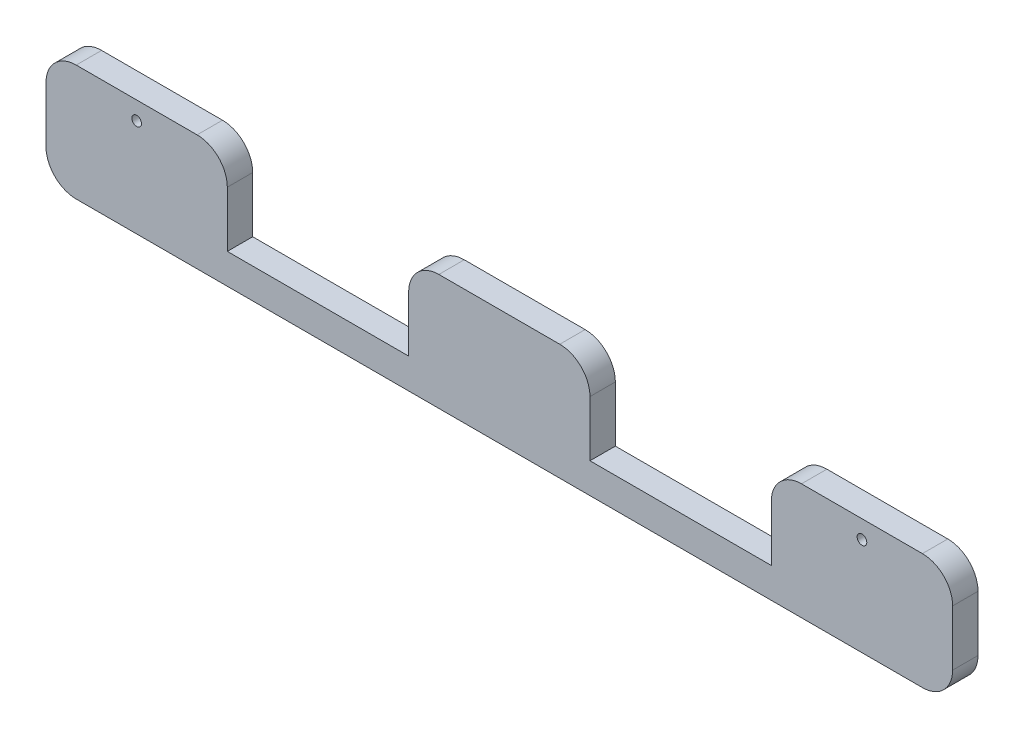
ISO-10303-21;
HEADER;
FILE_DESCRIPTION(('STEP AP214'),'2;1');
FILE_NAME('part.step','',(''),(''),'','','');
FILE_SCHEMA(('AUTOMOTIVE_DESIGN { 1 0 10303 214 1 1 1 1 }'));
ENDSEC;
DATA;
#1=APPLICATION_CONTEXT('core data for automotive mechanical design processes');
#2=APPLICATION_PROTOCOL_DEFINITION('international standard','automotive_design',2000,#1);
#3=PRODUCT_CONTEXT('',#1,'mechanical');
#4=PRODUCT('Part','Part','',(#3));
#5=PRODUCT_RELATED_PRODUCT_CATEGORY('part','',(#4));
#6=PRODUCT_DEFINITION_FORMATION('','',#4);
#7=PRODUCT_DEFINITION_CONTEXT('part definition',#1,'design');
#8=PRODUCT_DEFINITION('design','',#6,#7);
#9=PRODUCT_DEFINITION_SHAPE('','',#8);
#10=(LENGTH_UNIT() NAMED_UNIT(*) SI_UNIT(.MILLI.,.METRE.));
#11=(NAMED_UNIT(*) PLANE_ANGLE_UNIT() SI_UNIT($,.RADIAN.));
#12=(NAMED_UNIT(*) SI_UNIT($,.STERADIAN.) SOLID_ANGLE_UNIT());
#13=UNCERTAINTY_MEASURE_WITH_UNIT(LENGTH_MEASURE(1.E-05),#10,'distance_accuracy_value','');
#14=(GEOMETRIC_REPRESENTATION_CONTEXT(3) GLOBAL_UNCERTAINTY_ASSIGNED_CONTEXT((#13)) GLOBAL_UNIT_ASSIGNED_CONTEXT((#10,
#11,#12)) REPRESENTATION_CONTEXT('',''));
#15=CARTESIAN_POINT('',(0.,0.,0.));
#16=DIRECTION('',(0.,0.,1.));
#17=DIRECTION('',(1.,0.,0.));
#18=AXIS2_PLACEMENT_3D('',#15,#16,#17);
#19=CARTESIAN_POINT('',(-85.0624454176962,-35.0708196621493,5.334));
#20=DIRECTION('',(0.,-1.,0.));
#21=DIRECTION('',(0.,0.,-1.));
#22=AXIS2_PLACEMENT_3D('',#19,#20,#21);
#23=PLANE('',#22);
#24=DIRECTION('',(-1.,0.,0.));
#25=VECTOR('',#24,1.);
#26=CARTESIAN_POINT('',(-85.0624454176962,-35.0708196621493,5.334));
#27=LINE('',#26,#25);
#28=CARTESIAN_POINT('',(22.8875545823038,-35.0708196621493,5.334));
#29=VERTEX_POINT('',#28);
#30=CARTESIAN_POINT('',(-2.5124454176962,-35.0708196621493,5.334));
#31=VERTEX_POINT('',#30);
#32=EDGE_CURVE('E245',#29,#31,#27,.T.);
#33=ORIENTED_EDGE('',*,*,#32,.F.);
#34=DIRECTION('',(0.,0.,1.));
#35=VECTOR('',#34,1.);
#36=CARTESIAN_POINT('',(22.8875545823038,-35.0708196621493,5.334));
#37=LINE('',#36,#35);
#38=CARTESIAN_POINT('',(22.8875545823038,-35.0708196621493,0.));
#39=VERTEX_POINT('',#38);
#40=EDGE_CURVE('E278',#29,#39,#37,.F.);
#41=ORIENTED_EDGE('',*,*,#40,.T.);
#42=DIRECTION('',(-1.,0.,0.));
#43=VECTOR('',#42,1.);
#44=CARTESIAN_POINT('',(-85.0624454176962,-35.0708196621493,0.));
#45=LINE('',#44,#43);
#46=CARTESIAN_POINT('',(-2.5124454176962,-35.0708196621493,0.));
#47=VERTEX_POINT('',#46);
#48=EDGE_CURVE('E257',#39,#47,#45,.T.);
#49=ORIENTED_EDGE('',*,*,#48,.T.);
#50=DIRECTION('',(0.,0.,1.));
#51=VECTOR('',#50,1.);
#52=CARTESIAN_POINT('',(-2.5124454176962,-35.0708196621493,5.334));
#53=LINE('',#52,#51);
#54=EDGE_CURVE('E275',#47,#31,#53,.T.);
#55=ORIENTED_EDGE('',*,*,#54,.T.);
#56=EDGE_LOOP('',(#33,#41,#49,#55));
#57=FACE_BOUND('',#56,.T.);
#58=ADVANCED_FACE('F35',(#57),#23,.F.);
#59=CARTESIAN_POINT('',(-53.3124454176962,-35.0708196621493,5.334));
#60=VERTEX_POINT('',#59);
#61=CARTESIAN_POINT('',(-78.7124454176962,-35.0708196621493,5.334));
#62=VERTEX_POINT('',#61);
#63=EDGE_CURVE('E240',#60,#62,#27,.T.);
#64=ORIENTED_EDGE('',*,*,#63,.F.);
#65=DIRECTION('',(0.,0.,1.));
#66=VECTOR('',#65,1.);
#67=CARTESIAN_POINT('',(-53.3124454176962,-35.0708196621493,5.334));
#68=LINE('',#67,#66);
#69=CARTESIAN_POINT('',(-53.3124454176962,-35.0708196621493,0.));
#70=VERTEX_POINT('',#69);
#71=EDGE_CURVE('E300',#60,#70,#68,.F.);
#72=ORIENTED_EDGE('',*,*,#71,.T.);
#73=CARTESIAN_POINT('',(-78.7124454176962,-35.0708196621493,0.));
#74=VERTEX_POINT('',#73);
#75=EDGE_CURVE('E254',#70,#74,#45,.T.);
#76=ORIENTED_EDGE('',*,*,#75,.T.);
#77=DIRECTION('',(0.,0.,-1.));
#78=VECTOR('',#77,1.);
#79=CARTESIAN_POINT('',(-78.7124454176962,-35.0708196621493,5.334));
#80=LINE('',#79,#78);
#81=EDGE_CURVE('E298',#74,#62,#80,.F.);
#82=ORIENTED_EDGE('',*,*,#81,.T.);
#83=EDGE_LOOP('',(#64,#72,#76,#82));
#84=FACE_BOUND('',#83,.T.);
#85=ADVANCED_FACE('F377',(#84),#23,.F.);
#86=CARTESIAN_POINT('',(-85.0624454176962,-35.0708196621493,5.334));
#87=DIRECTION('',(1.,0.,0.));
#88=DIRECTION('',(0.,1.,0.));
#89=AXIS2_PLACEMENT_3D('',#86,#87,#88);
#90=PLANE('',#89);
#91=DIRECTION('',(0.,-1.,0.));
#92=VECTOR('',#91,1.);
#93=CARTESIAN_POINT('',(-85.0624454176962,-35.0708196621493,0.));
#94=LINE('',#93,#92);
#95=CARTESIAN_POINT('',(-85.0624454176962,-41.4208196621493,0.));
#96=VERTEX_POINT('',#95);
#97=CARTESIAN_POINT('',(-85.0624454176962,-53.1048196621493,0.));
#98=VERTEX_POINT('',#97);
#99=EDGE_CURVE('E227',#96,#98,#94,.T.);
#100=ORIENTED_EDGE('',*,*,#99,.T.);
#101=DIRECTION('',(0.,0.,-1.));
#102=VECTOR('',#101,1.);
#103=CARTESIAN_POINT('',(-85.0624454176962,-53.1048196621493,5.334));
#104=LINE('',#103,#102);
#105=CARTESIAN_POINT('',(-85.0624454176962,-53.1048196621493,5.334));
#106=VERTEX_POINT('',#105);
#107=EDGE_CURVE('E11',#98,#106,#104,.F.);
#108=ORIENTED_EDGE('',*,*,#107,.T.);
#109=DIRECTION('',(0.,-1.,0.));
#110=VECTOR('',#109,1.);
#111=CARTESIAN_POINT('',(-85.0624454176962,-35.0708196621493,5.334));
#112=LINE('',#111,#110);
#113=CARTESIAN_POINT('',(-85.0624454176962,-41.4208196621493,5.334));
#114=VERTEX_POINT('',#113);
#115=EDGE_CURVE('E230',#114,#106,#112,.T.);
#116=ORIENTED_EDGE('',*,*,#115,.F.);
#117=DIRECTION('',(0.,0.,-1.));
#118=VECTOR('',#117,1.);
#119=CARTESIAN_POINT('',(-85.0624454176962,-41.4208196621493,5.334));
#120=LINE('',#119,#118);
#121=EDGE_CURVE('E43',#114,#96,#120,.T.);
#122=ORIENTED_EDGE('',*,*,#121,.T.);
#123=EDGE_LOOP('',(#100,#108,#116,#122));
#124=FACE_BOUND('',#123,.T.);
#125=ADVANCED_FACE('F324',(#124),#90,.F.);
#126=CARTESIAN_POINT('',(-85.0624454176962,-59.4548196621493,5.334));
#127=DIRECTION('',(0.,1.,0.));
#128=DIRECTION('',(0.,0.,1.));
#129=AXIS2_PLACEMENT_3D('',#126,#127,#128);
#130=PLANE('',#129);
#131=DIRECTION('',(1.,0.,0.));
#132=VECTOR('',#131,1.);
#133=CARTESIAN_POINT('',(-85.0624454176962,-59.4548196621493,0.));
#134=LINE('',#133,#132);
#135=CARTESIAN_POINT('',(-78.7124454176962,-59.4548196621493,0.));
#136=VERTEX_POINT('',#135);
#137=CARTESIAN_POINT('',(99.0875545823038,-59.4548196621493,0.));
#138=VERTEX_POINT('',#137);
#139=EDGE_CURVE('E248',#136,#138,#134,.T.);
#140=ORIENTED_EDGE('',*,*,#139,.T.);
#141=DIRECTION('',(0.,0.,-1.));
#142=VECTOR('',#141,1.);
#143=CARTESIAN_POINT('',(99.0875545823038,-59.4548196621493,5.334));
#144=LINE('',#143,#142);
#145=CARTESIAN_POINT('',(99.0875545823038,-59.4548196621493,5.334));
#146=VERTEX_POINT('',#145);
#147=EDGE_CURVE('E318',#138,#146,#144,.F.);
#148=ORIENTED_EDGE('',*,*,#147,.T.);
#149=DIRECTION('',(1.,0.,0.));
#150=VECTOR('',#149,1.);
#151=CARTESIAN_POINT('',(-85.0624454176962,-59.4548196621493,5.334));
#152=LINE('',#151,#150);
#153=CARTESIAN_POINT('',(-78.7124454176962,-59.4548196621493,5.334));
#154=VERTEX_POINT('',#153);
#155=EDGE_CURVE('E233',#154,#146,#152,.T.);
#156=ORIENTED_EDGE('',*,*,#155,.F.);
#157=DIRECTION('',(0.,0.,-1.));
#158=VECTOR('',#157,1.);
#159=CARTESIAN_POINT('',(-78.7124454176962,-59.4548196621493,5.334));
#160=LINE('',#159,#158);
#161=EDGE_CURVE('E315',#154,#136,#160,.T.);
#162=ORIENTED_EDGE('',*,*,#161,.T.);
#163=EDGE_LOOP('',(#140,#148,#156,#162));
#164=FACE_BOUND('',#163,.T.);
#165=ADVANCED_FACE('F335',(#164),#130,.F.);
#166=CARTESIAN_POINT('',(105.437554582304,-35.0708196621493,5.334));
#167=DIRECTION('',(-1.,0.,0.));
#168=DIRECTION('',(0.,-1.,0.));
#169=AXIS2_PLACEMENT_3D('',#166,#167,#168);
#170=PLANE('',#169);
#171=DIRECTION('',(0.,1.,0.));
#172=VECTOR('',#171,1.);
#173=CARTESIAN_POINT('',(105.437554582304,-35.0708196621493,0.));
#174=LINE('',#173,#172);
#175=CARTESIAN_POINT('',(105.437554582304,-53.1048196621493,0.));
#176=VERTEX_POINT('',#175);
#177=CARTESIAN_POINT('',(105.437554582304,-41.4208196621493,0.));
#178=VERTEX_POINT('',#177);
#179=EDGE_CURVE('E251',#176,#178,#174,.T.);
#180=ORIENTED_EDGE('',*,*,#179,.T.);
#181=DIRECTION('',(0.,0.,-1.));
#182=VECTOR('',#181,1.);
#183=CARTESIAN_POINT('',(105.437554582304,-41.4208196621493,5.334));
#184=LINE('',#183,#182);
#185=CARTESIAN_POINT('',(105.437554582304,-41.4208196621493,5.334));
#186=VERTEX_POINT('',#185);
#187=EDGE_CURVE('E313',#178,#186,#184,.F.);
#188=ORIENTED_EDGE('',*,*,#187,.T.);
#189=DIRECTION('',(0.,1.,0.));
#190=VECTOR('',#189,1.);
#191=CARTESIAN_POINT('',(105.437554582304,-35.0708196621493,5.334));
#192=LINE('',#191,#190);
#193=CARTESIAN_POINT('',(105.437554582304,-53.1048196621493,5.334));
#194=VERTEX_POINT('',#193);
#195=EDGE_CURVE('E237',#194,#186,#192,.T.);
#196=ORIENTED_EDGE('',*,*,#195,.F.);
#197=DIRECTION('',(0.,0.,-1.));
#198=VECTOR('',#197,1.);
#199=CARTESIAN_POINT('',(105.437554582304,-53.1048196621493,5.334));
#200=LINE('',#199,#198);
#201=EDGE_CURVE('E310',#194,#176,#200,.T.);
#202=ORIENTED_EDGE('',*,*,#201,.T.);
#203=EDGE_LOOP('',(#180,#188,#196,#202));
#204=FACE_BOUND('',#203,.T.);
#205=ADVANCED_FACE('F346',(#204),#170,.F.);
#206=CARTESIAN_POINT('',(99.0875545823038,-35.0708196621493,0.));
#207=VERTEX_POINT('',#206);
#208=CARTESIAN_POINT('',(73.6875545823038,-35.0708196621493,0.));
#209=VERTEX_POINT('',#208);
#210=EDGE_CURVE('E234',#207,#209,#45,.T.);
#211=ORIENTED_EDGE('',*,*,#210,.T.);
#212=DIRECTION('',(0.,0.,1.));
#213=VECTOR('',#212,1.);
#214=CARTESIAN_POINT('',(73.6875545823038,-35.0708196621493,5.334));
#215=LINE('',#214,#213);
#216=CARTESIAN_POINT('',(73.6875545823038,-35.0708196621493,5.334));
#217=VERTEX_POINT('',#216);
#218=EDGE_CURVE('E305',#209,#217,#215,.T.);
#219=ORIENTED_EDGE('',*,*,#218,.T.);
#220=CARTESIAN_POINT('',(99.0875545823038,-35.0708196621493,5.334));
#221=VERTEX_POINT('',#220);
#222=EDGE_CURVE('E241',#221,#217,#27,.T.);
#223=ORIENTED_EDGE('',*,*,#222,.F.);
#224=DIRECTION('',(0.,0.,-1.));
#225=VECTOR('',#224,1.);
#226=CARTESIAN_POINT('',(99.0875545823038,-35.0708196621493,5.334));
#227=LINE('',#226,#225);
#228=EDGE_CURVE('E302',#221,#207,#227,.T.);
#229=ORIENTED_EDGE('',*,*,#228,.T.);
#230=EDGE_LOOP('',(#211,#219,#223,#229));
#231=FACE_BOUND('',#230,.T.);
#232=ADVANCED_FACE('F356',(#231),#23,.F.);
#233=CARTESIAN_POINT('',(0.,0.,5.334));
#234=DIRECTION('',(0.,0.,1.));
#235=DIRECTION('',(1.,0.,0.));
#236=AXIS2_PLACEMENT_3D('',#233,#234,#235);
#237=PLANE('',#236);
#238=CARTESIAN_POINT('',(86.3875545823038,-38.8808196621493,5.334));
#239=DIRECTION('',(0.,0.,1.));
#240=DIRECTION('',(-1.,0.,0.));
#241=AXIS2_PLACEMENT_3D('',#238,#239,#240);
#242=CIRCLE('',#241,1.016);
#243=CARTESIAN_POINT('',(85.3715545823038,-38.8808196621493,5.334));
#244=VERTEX_POINT('',#243);
#245=EDGE_CURVE('E456',#244,#244,#242,.T.);
#246=ORIENTED_EDGE('',*,*,#245,.F.);
#247=EDGE_LOOP('',(#246));
#248=FACE_BOUND('',#247,.T.);
#249=CARTESIAN_POINT('',(-66.0124454176962,-38.8808196621493,5.334));
#250=DIRECTION('',(0.,0.,1.));
#251=DIRECTION('',(1.,0.,0.));
#252=AXIS2_PLACEMENT_3D('',#249,#250,#251);
#253=CIRCLE('',#252,1.016);
#254=CARTESIAN_POINT('',(-64.9964454176962,-38.8808196621493,5.334));
#255=VERTEX_POINT('',#254);
#256=EDGE_CURVE('E452',#255,#255,#253,.T.);
#257=ORIENTED_EDGE('',*,*,#256,.F.);
#258=EDGE_LOOP('',(#257));
#259=FACE_BOUND('',#258,.T.);
#260=DIRECTION('',(0.,-1.,0.));
#261=VECTOR('',#260,1.);
#262=CARTESIAN_POINT('',(29.2375545823038,-35.0708196621493,5.334));
#263=LINE('',#262,#261);
#264=CARTESIAN_POINT('',(29.2375545823038,-41.4208196621493,5.334));
#265=VERTEX_POINT('',#264);
#266=CARTESIAN_POINT('',(29.2375545823038,-53.1048196621493,5.334));
#267=VERTEX_POINT('',#266);
#268=EDGE_CURVE('E190',#265,#267,#263,.T.);
#269=ORIENTED_EDGE('',*,*,#268,.F.);
#270=CARTESIAN_POINT('',(22.8875545823038,-41.4208196621493,5.334));
#271=DIRECTION('',(0.,0.,1.));
#272=DIRECTION('',(1.,0.,0.));
#273=AXIS2_PLACEMENT_3D('',#270,#271,#272);
#274=CIRCLE('',#273,6.35);
#275=EDGE_CURVE('E273',#265,#29,#274,.T.);
#276=ORIENTED_EDGE('',*,*,#275,.T.);
#277=ORIENTED_EDGE('',*,*,#32,.T.);
#278=CARTESIAN_POINT('',(-2.5124454176962,-41.4208196621493,5.334));
#279=DIRECTION('',(0.,0.,1.));
#280=DIRECTION('',(1.,0.,0.));
#281=AXIS2_PLACEMENT_3D('',#278,#279,#280);
#282=CIRCLE('',#281,6.35);
#283=CARTESIAN_POINT('',(-8.86244541769619,-41.4208196621493,5.334));
#284=VERTEX_POINT('',#283);
#285=EDGE_CURVE('E271',#31,#284,#282,.T.);
#286=ORIENTED_EDGE('',*,*,#285,.T.);
#287=DIRECTION('',(0.,1.,0.));
#288=VECTOR('',#287,1.);
#289=CARTESIAN_POINT('',(-8.86244541769619,-35.0708196621493,5.334));
#290=LINE('',#289,#288);
#291=CARTESIAN_POINT('',(-8.86244541769618,-53.1048196621493,5.334));
#292=VERTEX_POINT('',#291);
#293=EDGE_CURVE('E214',#292,#284,#290,.T.);
#294=ORIENTED_EDGE('',*,*,#293,.F.);
#295=DIRECTION('',(1.,0.,0.));
#296=VECTOR('',#295,1.);
#297=CARTESIAN_POINT('',(-46.9624454176962,-53.1048196621493,5.334));
#298=LINE('',#297,#296);
#299=CARTESIAN_POINT('',(-46.9624454176962,-53.1048196621493,5.334));
#300=VERTEX_POINT('',#299);
#301=EDGE_CURVE('E221',#300,#292,#298,.T.);
#302=ORIENTED_EDGE('',*,*,#301,.F.);
#303=DIRECTION('',(0.,-1.,0.));
#304=VECTOR('',#303,1.);
#305=CARTESIAN_POINT('',(-46.9624454176962,-35.0708196621493,5.334));
#306=LINE('',#305,#304);
#307=CARTESIAN_POINT('',(-46.9624454176962,-41.4208196621493,5.334));
#308=VERTEX_POINT('',#307);
#309=EDGE_CURVE('E209',#308,#300,#306,.T.);
#310=ORIENTED_EDGE('',*,*,#309,.F.);
#311=CARTESIAN_POINT('',(-53.3124454176962,-41.4208196621493,5.334));
#312=DIRECTION('',(0.,0.,1.));
#313=DIRECTION('',(1.,0.,0.));
#314=AXIS2_PLACEMENT_3D('',#311,#312,#313);
#315=CIRCLE('',#314,6.35);
#316=EDGE_CURVE('E269',#308,#60,#315,.T.);
#317=ORIENTED_EDGE('',*,*,#316,.T.);
#318=ORIENTED_EDGE('',*,*,#63,.T.);
#319=CARTESIAN_POINT('',(-78.7124454176962,-41.4208196621493,5.334));
#320=DIRECTION('',(0.,0.,1.));
#321=DIRECTION('',(1.,0.,0.));
#322=AXIS2_PLACEMENT_3D('',#319,#320,#321);
#323=CIRCLE('',#322,6.35);
#324=EDGE_CURVE('E259',#62,#114,#323,.T.);
#325=ORIENTED_EDGE('',*,*,#324,.T.);
#326=ORIENTED_EDGE('',*,*,#115,.T.);
#327=CARTESIAN_POINT('',(-78.7124454176962,-53.1048196621493,5.334));
#328=DIRECTION('',(0.,0.,1.));
#329=DIRECTION('',(1.,0.,0.));
#330=AXIS2_PLACEMENT_3D('',#327,#328,#329);
#331=CIRCLE('',#330,6.35);
#332=EDGE_CURVE('E261',#106,#154,#331,.T.);
#333=ORIENTED_EDGE('',*,*,#332,.T.);
#334=ORIENTED_EDGE('',*,*,#155,.T.);
#335=CARTESIAN_POINT('',(99.0875545823038,-53.1048196621493,5.334));
#336=DIRECTION('',(0.,0.,1.));
#337=DIRECTION('',(1.,0.,0.));
#338=AXIS2_PLACEMENT_3D('',#335,#336,#337);
#339=CIRCLE('',#338,6.35);
#340=EDGE_CURVE('E263',#146,#194,#339,.T.);
#341=ORIENTED_EDGE('',*,*,#340,.T.);
#342=ORIENTED_EDGE('',*,*,#195,.T.);
#343=CARTESIAN_POINT('',(99.0875545823038,-41.4208196621493,5.334));
#344=DIRECTION('',(0.,0.,1.));
#345=DIRECTION('',(1.,0.,0.));
#346=AXIS2_PLACEMENT_3D('',#343,#344,#345);
#347=CIRCLE('',#346,6.35);
#348=EDGE_CURVE('E265',#186,#221,#347,.T.);
#349=ORIENTED_EDGE('',*,*,#348,.T.);
#350=ORIENTED_EDGE('',*,*,#222,.T.);
#351=CARTESIAN_POINT('',(73.6875545823038,-41.4208196621493,5.334));
#352=DIRECTION('',(0.,0.,1.));
#353=DIRECTION('',(1.,0.,0.));
#354=AXIS2_PLACEMENT_3D('',#351,#352,#353);
#355=CIRCLE('',#354,6.35);
#356=CARTESIAN_POINT('',(67.3375545823038,-41.4208196621493,5.334));
#357=VERTEX_POINT('',#356);
#358=EDGE_CURVE('E267',#217,#357,#355,.T.);
#359=ORIENTED_EDGE('',*,*,#358,.T.);
#360=DIRECTION('',(0.,1.,0.));
#361=VECTOR('',#360,1.);
#362=CARTESIAN_POINT('',(67.3375545823038,-35.0708196621493,5.334));
#363=LINE('',#362,#361);
#364=CARTESIAN_POINT('',(67.3375545823038,-53.1048196621493,5.334));
#365=VERTEX_POINT('',#364);
#366=EDGE_CURVE('E184',#365,#357,#363,.T.);
#367=ORIENTED_EDGE('',*,*,#366,.F.);
#368=DIRECTION('',(1.,0.,0.));
#369=VECTOR('',#368,1.);
#370=CARTESIAN_POINT('',(29.2375545823038,-53.1048196621493,5.334));
#371=LINE('',#370,#369);
#372=EDGE_CURVE('E204',#267,#365,#371,.T.);
#373=ORIENTED_EDGE('',*,*,#372,.F.);
#374=EDGE_LOOP('',(#269,#276,#277,#286,#294,#302,#310,#317,#318,#325,#326,#333,#334,#341,#342,
#349,#350,#359,#367,#373));
#375=FACE_BOUND('',#374,.T.);
#376=ADVANCED_FACE('F339',(#248,#259,#375),#237,.T.);
#377=CARTESIAN_POINT('',(0.,0.,0.));
#378=DIRECTION('',(0.,0.,1.));
#379=DIRECTION('',(1.,0.,0.));
#380=AXIS2_PLACEMENT_3D('',#377,#378,#379);
#381=PLANE('',#380);
#382=CARTESIAN_POINT('',(86.3875545823038,-38.8808196621493,0.));
#383=DIRECTION('',(0.,0.,1.));
#384=DIRECTION('',(-1.,0.,0.));
#385=AXIS2_PLACEMENT_3D('',#382,#383,#384);
#386=CIRCLE('',#385,1.016);
#387=CARTESIAN_POINT('',(85.3715545823038,-38.8808196621493,0.));
#388=VERTEX_POINT('',#387);
#389=EDGE_CURVE('E448',#388,#388,#386,.T.);
#390=ORIENTED_EDGE('',*,*,#389,.T.);
#391=EDGE_LOOP('',(#390));
#392=FACE_BOUND('',#391,.T.);
#393=CARTESIAN_POINT('',(-66.0124454176962,-38.8808196621493,0.));
#394=DIRECTION('',(0.,0.,1.));
#395=DIRECTION('',(1.,0.,0.));
#396=AXIS2_PLACEMENT_3D('',#393,#394,#395);
#397=CIRCLE('',#396,1.016);
#398=CARTESIAN_POINT('',(-64.9964454176962,-38.8808196621493,0.));
#399=VERTEX_POINT('',#398);
#400=EDGE_CURVE('E205',#399,#399,#397,.T.);
#401=ORIENTED_EDGE('',*,*,#400,.T.);
#402=EDGE_LOOP('',(#401));
#403=FACE_BOUND('',#402,.T.);
#404=ORIENTED_EDGE('',*,*,#48,.F.);
#405=CARTESIAN_POINT('',(22.8875545823038,-41.4208196621493,0.));
#406=DIRECTION('',(0.,0.,1.));
#407=DIRECTION('',(1.,0.,0.));
#408=AXIS2_PLACEMENT_3D('',#405,#406,#407);
#409=CIRCLE('',#408,6.35);
#410=CARTESIAN_POINT('',(29.2375545823038,-41.4208196621493,0.));
#411=VERTEX_POINT('',#410);
#412=EDGE_CURVE('E180',#39,#411,#409,.F.);
#413=ORIENTED_EDGE('',*,*,#412,.T.);
#414=DIRECTION('',(0.,-1.,0.));
#415=VECTOR('',#414,1.);
#416=CARTESIAN_POINT('',(29.2375545823038,-35.0708196621493,0.));
#417=LINE('',#416,#415);
#418=CARTESIAN_POINT('',(29.2375545823038,-53.1048196621493,0.));
#419=VERTEX_POINT('',#418);
#420=EDGE_CURVE('E172',#411,#419,#417,.T.);
#421=ORIENTED_EDGE('',*,*,#420,.T.);
#422=DIRECTION('',(1.,0.,0.));
#423=VECTOR('',#422,1.);
#424=CARTESIAN_POINT('',(29.2375545823038,-53.1048196621493,0.));
#425=LINE('',#424,#423);
#426=CARTESIAN_POINT('',(67.3375545823038,-53.1048196621493,0.));
#427=VERTEX_POINT('',#426);
#428=EDGE_CURVE('E178',#419,#427,#425,.T.);
#429=ORIENTED_EDGE('',*,*,#428,.T.);
#430=DIRECTION('',(0.,1.,0.));
#431=VECTOR('',#430,1.);
#432=CARTESIAN_POINT('',(67.3375545823038,-35.0708196621493,0.));
#433=LINE('',#432,#431);
#434=CARTESIAN_POINT('',(67.3375545823038,-41.4208196621493,0.));
#435=VERTEX_POINT('',#434);
#436=EDGE_CURVE('E195',#427,#435,#433,.T.);
#437=ORIENTED_EDGE('',*,*,#436,.T.);
#438=CARTESIAN_POINT('',(73.6875545823038,-41.4208196621493,0.));
#439=DIRECTION('',(0.,0.,1.));
#440=DIRECTION('',(1.,0.,0.));
#441=AXIS2_PLACEMENT_3D('',#438,#439,#440);
#442=CIRCLE('',#441,6.35);
#443=EDGE_CURVE('E288',#435,#209,#442,.F.);
#444=ORIENTED_EDGE('',*,*,#443,.T.);
#445=ORIENTED_EDGE('',*,*,#210,.F.);
#446=CARTESIAN_POINT('',(99.0875545823038,-41.4208196621493,0.));
#447=DIRECTION('',(0.,0.,1.));
#448=DIRECTION('',(1.,0.,0.));
#449=AXIS2_PLACEMENT_3D('',#446,#447,#448);
#450=CIRCLE('',#449,6.35);
#451=EDGE_CURVE('E286',#207,#178,#450,.F.);
#452=ORIENTED_EDGE('',*,*,#451,.T.);
#453=ORIENTED_EDGE('',*,*,#179,.F.);
#454=CARTESIAN_POINT('',(99.0875545823038,-53.1048196621493,0.));
#455=DIRECTION('',(0.,0.,1.));
#456=DIRECTION('',(1.,0.,0.));
#457=AXIS2_PLACEMENT_3D('',#454,#455,#456);
#458=CIRCLE('',#457,6.35);
#459=EDGE_CURVE('E284',#176,#138,#458,.F.);
#460=ORIENTED_EDGE('',*,*,#459,.T.);
#461=ORIENTED_EDGE('',*,*,#139,.F.);
#462=CARTESIAN_POINT('',(-78.7124454176962,-53.1048196621493,0.));
#463=DIRECTION('',(0.,0.,1.));
#464=DIRECTION('',(1.,0.,0.));
#465=AXIS2_PLACEMENT_3D('',#462,#463,#464);
#466=CIRCLE('',#465,6.35);
#467=EDGE_CURVE('E282',#136,#98,#466,.F.);
#468=ORIENTED_EDGE('',*,*,#467,.T.);
#469=ORIENTED_EDGE('',*,*,#99,.F.);
#470=CARTESIAN_POINT('',(-78.7124454176962,-41.4208196621493,0.));
#471=DIRECTION('',(0.,0.,1.));
#472=DIRECTION('',(1.,0.,0.));
#473=AXIS2_PLACEMENT_3D('',#470,#471,#472);
#474=CIRCLE('',#473,6.35);
#475=EDGE_CURVE('E280',#96,#74,#474,.F.);
#476=ORIENTED_EDGE('',*,*,#475,.T.);
#477=ORIENTED_EDGE('',*,*,#75,.F.);
#478=CARTESIAN_POINT('',(-53.3124454176962,-41.4208196621493,0.));
#479=DIRECTION('',(0.,0.,1.));
#480=DIRECTION('',(1.,0.,0.));
#481=AXIS2_PLACEMENT_3D('',#478,#479,#480);
#482=CIRCLE('',#481,6.35);
#483=CARTESIAN_POINT('',(-46.9624454176962,-41.4208196621493,0.));
#484=VERTEX_POINT('',#483);
#485=EDGE_CURVE('E58',#70,#484,#482,.F.);
#486=ORIENTED_EDGE('',*,*,#485,.T.);
#487=DIRECTION('',(0.,-1.,0.));
#488=VECTOR('',#487,1.);
#489=CARTESIAN_POINT('',(-46.9624454176962,-35.0708196621493,0.));
#490=LINE('',#489,#488);
#491=CARTESIAN_POINT('',(-46.9624454176962,-53.1048196621493,0.));
#492=VERTEX_POINT('',#491);
#493=EDGE_CURVE('E211',#484,#492,#490,.T.);
#494=ORIENTED_EDGE('',*,*,#493,.T.);
#495=DIRECTION('',(1.,0.,0.));
#496=VECTOR('',#495,1.);
#497=CARTESIAN_POINT('',(-46.9624454176962,-53.1048196621493,0.));
#498=LINE('',#497,#496);
#499=CARTESIAN_POINT('',(-8.86244541769618,-53.1048196621493,0.));
#500=VERTEX_POINT('',#499);
#501=EDGE_CURVE('E213',#492,#500,#498,.T.);
#502=ORIENTED_EDGE('',*,*,#501,.T.);
#503=DIRECTION('',(0.,1.,0.));
#504=VECTOR('',#503,1.);
#505=CARTESIAN_POINT('',(-8.86244541769619,-35.0708196621493,0.));
#506=LINE('',#505,#504);
#507=CARTESIAN_POINT('',(-8.86244541769619,-41.4208196621493,0.));
#508=VERTEX_POINT('',#507);
#509=EDGE_CURVE('E217',#500,#508,#506,.T.);
#510=ORIENTED_EDGE('',*,*,#509,.T.);
#511=CARTESIAN_POINT('',(-2.5124454176962,-41.4208196621493,0.));
#512=DIRECTION('',(0.,0.,1.));
#513=DIRECTION('',(1.,0.,0.));
#514=AXIS2_PLACEMENT_3D('',#511,#512,#513);
#515=CIRCLE('',#514,6.35);
#516=EDGE_CURVE('E291',#508,#47,#515,.F.);
#517=ORIENTED_EDGE('',*,*,#516,.T.);
#518=EDGE_LOOP('',(#404,#413,#421,#429,#437,#444,#445,#452,#453,#460,#461,#468,#469,#476,#477,
#486,#494,#502,#510,#517));
#519=FACE_BOUND('',#518,.T.);
#520=ADVANCED_FACE('F175',(#392,#403,#519),#381,.F.);
#521=CARTESIAN_POINT('',(-46.9624454176962,-35.0708196621493,0.));
#522=DIRECTION('',(-1.,0.,0.));
#523=DIRECTION('',(0.,-1.,0.));
#524=AXIS2_PLACEMENT_3D('',#521,#522,#523);
#525=PLANE('',#524);
#526=ORIENTED_EDGE('',*,*,#493,.F.);
#527=DIRECTION('',(0.,0.,1.));
#528=VECTOR('',#527,1.);
#529=CARTESIAN_POINT('',(-46.9624454176962,-41.4208196621493,0.));
#530=LINE('',#529,#528);
#531=EDGE_CURVE('E295',#484,#308,#530,.T.);
#532=ORIENTED_EDGE('',*,*,#531,.T.);
#533=ORIENTED_EDGE('',*,*,#309,.T.);
#534=DIRECTION('',(0.,0.,1.));
#535=VECTOR('',#534,1.);
#536=CARTESIAN_POINT('',(-46.9624454176962,-53.1048196621493,0.));
#537=LINE('',#536,#535);
#538=EDGE_CURVE('E219',#492,#300,#537,.T.);
#539=ORIENTED_EDGE('',*,*,#538,.F.);
#540=EDGE_LOOP('',(#526,#532,#533,#539));
#541=FACE_BOUND('',#540,.T.);
#542=ADVANCED_FACE('F423',(#541),#525,.F.);
#543=CARTESIAN_POINT('',(-8.86244541769619,-35.0708196621493,0.));
#544=DIRECTION('',(1.,0.,0.));
#545=DIRECTION('',(0.,1.,0.));
#546=AXIS2_PLACEMENT_3D('',#543,#544,#545);
#547=PLANE('',#546);
#548=ORIENTED_EDGE('',*,*,#293,.T.);
#549=DIRECTION('',(0.,0.,1.));
#550=VECTOR('',#549,1.);
#551=CARTESIAN_POINT('',(-8.86244541769619,-41.4208196621493,0.));
#552=LINE('',#551,#550);
#553=EDGE_CURVE('E50',#284,#508,#552,.F.);
#554=ORIENTED_EDGE('',*,*,#553,.T.);
#555=ORIENTED_EDGE('',*,*,#509,.F.);
#556=DIRECTION('',(0.,0.,1.));
#557=VECTOR('',#556,1.);
#558=CARTESIAN_POINT('',(-8.86244541769618,-53.1048196621493,0.));
#559=LINE('',#558,#557);
#560=EDGE_CURVE('E225',#500,#292,#559,.T.);
#561=ORIENTED_EDGE('',*,*,#560,.T.);
#562=EDGE_LOOP('',(#548,#554,#555,#561));
#563=FACE_BOUND('',#562,.T.);
#564=ADVANCED_FACE('F430',(#563),#547,.F.);
#565=CARTESIAN_POINT('',(-46.9624454176962,-53.1048196621493,0.));
#566=DIRECTION('',(0.,-1.,0.));
#567=DIRECTION('',(0.,0.,-1.));
#568=AXIS2_PLACEMENT_3D('',#565,#566,#567);
#569=PLANE('',#568);
#570=ORIENTED_EDGE('',*,*,#301,.T.);
#571=ORIENTED_EDGE('',*,*,#560,.F.);
#572=ORIENTED_EDGE('',*,*,#501,.F.);
#573=ORIENTED_EDGE('',*,*,#538,.T.);
#574=EDGE_LOOP('',(#570,#571,#572,#573));
#575=FACE_BOUND('',#574,.T.);
#576=ADVANCED_FACE('F428',(#575),#569,.F.);
#577=CARTESIAN_POINT('',(29.2375545823038,-35.0708196621493,0.));
#578=DIRECTION('',(-1.,0.,0.));
#579=DIRECTION('',(0.,-1.,0.));
#580=AXIS2_PLACEMENT_3D('',#577,#578,#579);
#581=PLANE('',#580);
#582=ORIENTED_EDGE('',*,*,#420,.F.);
#583=DIRECTION('',(0.,0.,1.));
#584=VECTOR('',#583,1.);
#585=CARTESIAN_POINT('',(29.2375545823038,-41.4208196621493,0.));
#586=LINE('',#585,#584);
#587=EDGE_CURVE('E244',#411,#265,#586,.T.);
#588=ORIENTED_EDGE('',*,*,#587,.T.);
#589=ORIENTED_EDGE('',*,*,#268,.T.);
#590=DIRECTION('',(0.,0.,1.));
#591=VECTOR('',#590,1.);
#592=CARTESIAN_POINT('',(29.2375545823038,-53.1048196621493,0.));
#593=LINE('',#592,#591);
#594=EDGE_CURVE('E187',#419,#267,#593,.T.);
#595=ORIENTED_EDGE('',*,*,#594,.F.);
#596=EDGE_LOOP('',(#582,#588,#589,#595));
#597=FACE_BOUND('',#596,.T.);
#598=ADVANCED_FACE('F188',(#597),#581,.F.);
#599=CARTESIAN_POINT('',(67.3375545823038,-35.0708196621493,0.));
#600=DIRECTION('',(1.,0.,0.));
#601=DIRECTION('',(0.,1.,0.));
#602=AXIS2_PLACEMENT_3D('',#599,#600,#601);
#603=PLANE('',#602);
#604=ORIENTED_EDGE('',*,*,#366,.T.);
#605=DIRECTION('',(0.,0.,1.));
#606=VECTOR('',#605,1.);
#607=CARTESIAN_POINT('',(67.3375545823038,-41.4208196621493,0.));
#608=LINE('',#607,#606);
#609=EDGE_CURVE('E308',#357,#435,#608,.F.);
#610=ORIENTED_EDGE('',*,*,#609,.T.);
#611=ORIENTED_EDGE('',*,*,#436,.F.);
#612=DIRECTION('',(0.,0.,1.));
#613=VECTOR('',#612,1.);
#614=CARTESIAN_POINT('',(67.3375545823038,-53.1048196621493,0.));
#615=LINE('',#614,#613);
#616=EDGE_CURVE('E194',#427,#365,#615,.T.);
#617=ORIENTED_EDGE('',*,*,#616,.T.);
#618=EDGE_LOOP('',(#604,#610,#611,#617));
#619=FACE_BOUND('',#618,.T.);
#620=ADVANCED_FACE('F362',(#619),#603,.F.);
#621=CARTESIAN_POINT('',(29.2375545823038,-53.1048196621493,0.));
#622=DIRECTION('',(0.,-1.,0.));
#623=DIRECTION('',(0.,0.,-1.));
#624=AXIS2_PLACEMENT_3D('',#621,#622,#623);
#625=PLANE('',#624);
#626=ORIENTED_EDGE('',*,*,#372,.T.);
#627=ORIENTED_EDGE('',*,*,#616,.F.);
#628=ORIENTED_EDGE('',*,*,#428,.F.);
#629=ORIENTED_EDGE('',*,*,#594,.T.);
#630=EDGE_LOOP('',(#626,#627,#628,#629));
#631=FACE_BOUND('',#630,.T.);
#632=ADVANCED_FACE('F198',(#631),#625,.F.);
#633=CARTESIAN_POINT('',(-66.0124454176962,-38.8808196621493,0.));
#634=DIRECTION('',(0.,0.,1.));
#635=DIRECTION('',(1.,0.,0.));
#636=AXIS2_PLACEMENT_3D('',#633,#634,#635);
#637=CYLINDRICAL_SURFACE('',#636,1.016);
#638=ORIENTED_EDGE('',*,*,#400,.F.);
#639=EDGE_LOOP('',(#638));
#640=FACE_BOUND('',#639,.T.);
#641=ORIENTED_EDGE('',*,*,#256,.T.);
#642=EDGE_LOOP('',(#641));
#643=FACE_BOUND('',#642,.T.);
#644=ADVANCED_FACE('F464',(#640,#643),#637,.F.);
#645=CARTESIAN_POINT('',(86.3875545823038,-38.8808196621493,0.));
#646=DIRECTION('',(0.,0.,1.));
#647=DIRECTION('',(1.,0.,0.));
#648=AXIS2_PLACEMENT_3D('',#645,#646,#647);
#649=CYLINDRICAL_SURFACE('',#648,1.016);
#650=ORIENTED_EDGE('',*,*,#389,.F.);
#651=EDGE_LOOP('',(#650));
#652=FACE_BOUND('',#651,.T.);
#653=ORIENTED_EDGE('',*,*,#245,.T.);
#654=EDGE_LOOP('',(#653));
#655=FACE_BOUND('',#654,.T.);
#656=ADVANCED_FACE('F404',(#652,#655),#649,.F.);
#657=CARTESIAN_POINT('',(22.8875545823038,-41.4208196621493,0.));
#658=DIRECTION('',(0.,0.,1.));
#659=DIRECTION('',(1.,0.,0.));
#660=AXIS2_PLACEMENT_3D('',#657,#658,#659);
#661=CYLINDRICAL_SURFACE('',#660,6.35);
#662=ORIENTED_EDGE('',*,*,#412,.F.);
#663=ORIENTED_EDGE('',*,*,#40,.F.);
#664=ORIENTED_EDGE('',*,*,#275,.F.);
#665=ORIENTED_EDGE('',*,*,#587,.F.);
#666=EDGE_LOOP('',(#662,#663,#664,#665));
#667=FACE_BOUND('',#666,.T.);
#668=ADVANCED_FACE('F401',(#667),#661,.T.);
#669=CARTESIAN_POINT('',(-2.5124454176962,-41.4208196621493,5.334));
#670=DIRECTION('',(0.,0.,1.));
#671=DIRECTION('',(1.,0.,0.));
#672=AXIS2_PLACEMENT_3D('',#669,#670,#671);
#673=CYLINDRICAL_SURFACE('',#672,6.35);
#674=ORIENTED_EDGE('',*,*,#516,.F.);
#675=ORIENTED_EDGE('',*,*,#553,.F.);
#676=ORIENTED_EDGE('',*,*,#285,.F.);
#677=ORIENTED_EDGE('',*,*,#54,.F.);
#678=EDGE_LOOP('',(#674,#675,#676,#677));
#679=FACE_BOUND('',#678,.T.);
#680=ADVANCED_FACE('F373',(#679),#673,.T.);
#681=CARTESIAN_POINT('',(-53.3124454176962,-41.4208196621493,0.));
#682=DIRECTION('',(0.,0.,1.));
#683=DIRECTION('',(1.,0.,0.));
#684=AXIS2_PLACEMENT_3D('',#681,#682,#683);
#685=CYLINDRICAL_SURFACE('',#684,6.35);
#686=ORIENTED_EDGE('',*,*,#485,.F.);
#687=ORIENTED_EDGE('',*,*,#71,.F.);
#688=ORIENTED_EDGE('',*,*,#316,.F.);
#689=ORIENTED_EDGE('',*,*,#531,.F.);
#690=EDGE_LOOP('',(#686,#687,#688,#689));
#691=FACE_BOUND('',#690,.T.);
#692=ADVANCED_FACE('F366',(#691),#685,.T.);
#693=CARTESIAN_POINT('',(73.6875545823038,-41.4208196621493,5.334));
#694=DIRECTION('',(0.,0.,1.));
#695=DIRECTION('',(1.,0.,0.));
#696=AXIS2_PLACEMENT_3D('',#693,#694,#695);
#697=CYLINDRICAL_SURFACE('',#696,6.35);
#698=ORIENTED_EDGE('',*,*,#443,.F.);
#699=ORIENTED_EDGE('',*,*,#609,.F.);
#700=ORIENTED_EDGE('',*,*,#358,.F.);
#701=ORIENTED_EDGE('',*,*,#218,.F.);
#702=EDGE_LOOP('',(#698,#699,#700,#701));
#703=FACE_BOUND('',#702,.T.);
#704=ADVANCED_FACE('F364',(#703),#697,.T.);
#705=CARTESIAN_POINT('',(99.0875545823038,-41.4208196621493,5.334));
#706=DIRECTION('',(0.,0.,-1.));
#707=DIRECTION('',(-1.,0.,0.));
#708=AXIS2_PLACEMENT_3D('',#705,#706,#707);
#709=CYLINDRICAL_SURFACE('',#708,6.35);
#710=ORIENTED_EDGE('',*,*,#348,.F.);
#711=ORIENTED_EDGE('',*,*,#187,.F.);
#712=ORIENTED_EDGE('',*,*,#451,.F.);
#713=ORIENTED_EDGE('',*,*,#228,.F.);
#714=EDGE_LOOP('',(#710,#711,#712,#713));
#715=FACE_BOUND('',#714,.T.);
#716=ADVANCED_FACE('F353',(#715),#709,.T.);
#717=CARTESIAN_POINT('',(99.0875545823038,-53.1048196621493,5.334));
#718=DIRECTION('',(0.,0.,-1.));
#719=DIRECTION('',(-1.,0.,0.));
#720=AXIS2_PLACEMENT_3D('',#717,#718,#719);
#721=CYLINDRICAL_SURFACE('',#720,6.35);
#722=ORIENTED_EDGE('',*,*,#340,.F.);
#723=ORIENTED_EDGE('',*,*,#147,.F.);
#724=ORIENTED_EDGE('',*,*,#459,.F.);
#725=ORIENTED_EDGE('',*,*,#201,.F.);
#726=EDGE_LOOP('',(#722,#723,#724,#725));
#727=FACE_BOUND('',#726,.T.);
#728=ADVANCED_FACE('F343',(#727),#721,.T.);
#729=CARTESIAN_POINT('',(-78.7124454176962,-53.1048196621493,5.334));
#730=DIRECTION('',(0.,0.,-1.));
#731=DIRECTION('',(-1.,0.,0.));
#732=AXIS2_PLACEMENT_3D('',#729,#730,#731);
#733=CYLINDRICAL_SURFACE('',#732,6.35);
#734=ORIENTED_EDGE('',*,*,#332,.F.);
#735=ORIENTED_EDGE('',*,*,#107,.F.);
#736=ORIENTED_EDGE('',*,*,#467,.F.);
#737=ORIENTED_EDGE('',*,*,#161,.F.);
#738=EDGE_LOOP('',(#734,#735,#736,#737));
#739=FACE_BOUND('',#738,.T.);
#740=ADVANCED_FACE('F332',(#739),#733,.T.);
#741=CARTESIAN_POINT('',(-78.7124454176962,-41.4208196621493,5.334));
#742=DIRECTION('',(0.,0.,-1.));
#743=DIRECTION('',(-1.,0.,0.));
#744=AXIS2_PLACEMENT_3D('',#741,#742,#743);
#745=CYLINDRICAL_SURFACE('',#744,6.35);
#746=ORIENTED_EDGE('',*,*,#324,.F.);
#747=ORIENTED_EDGE('',*,*,#81,.F.);
#748=ORIENTED_EDGE('',*,*,#475,.F.);
#749=ORIENTED_EDGE('',*,*,#121,.F.);
#750=EDGE_LOOP('',(#746,#747,#748,#749));
#751=FACE_BOUND('',#750,.T.);
#752=ADVANCED_FACE('F37',(#751),#745,.T.);
#753=CLOSED_SHELL('',(#58,#85,#125,#165,#205,#232,#376,#520,#542,#564,#576,#598,#620,#632,#644,
#656,#668,#680,#692,#704,#716,#728,#740,#752));
#754=MANIFOLD_SOLID_BREP('B2',#753);
#755=ADVANCED_BREP_SHAPE_REPRESENTATION('',(#18,#754),#14);
#756=SHAPE_DEFINITION_REPRESENTATION(#9,#755);
ENDSEC;
END-ISO-10303-21;
